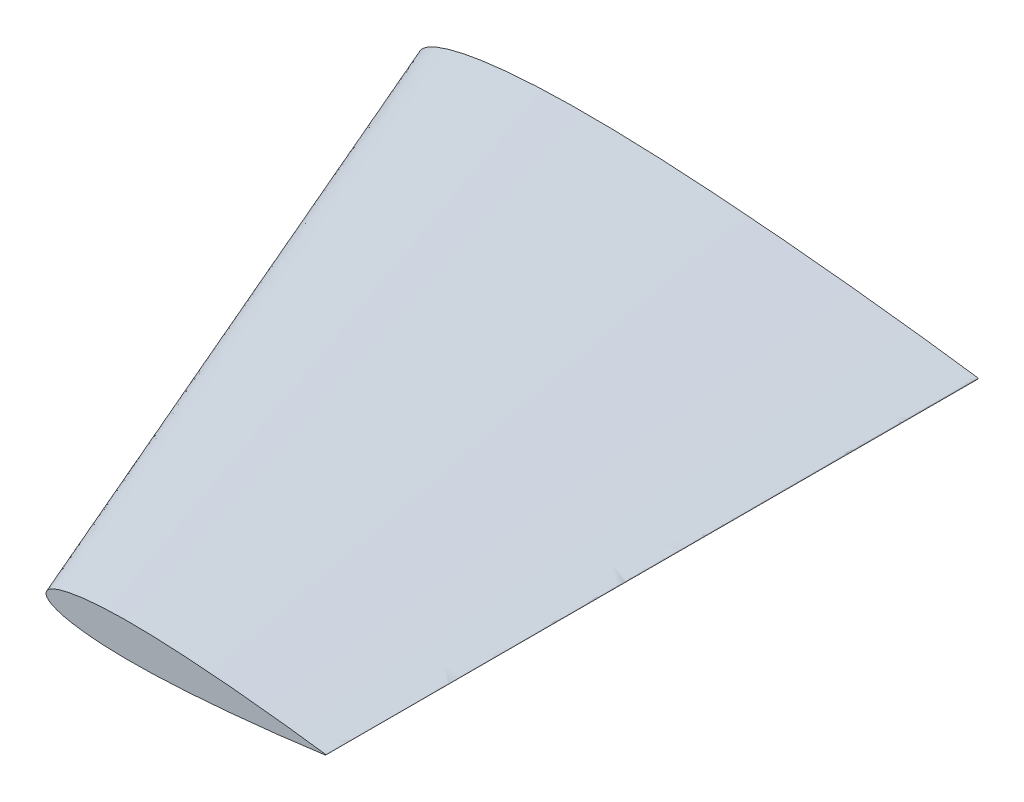
ISO-10303-21;
HEADER;
FILE_DESCRIPTION(('STEP AP214'),'2;1');
FILE_NAME('part.step','',(''),(''),'','','');
FILE_SCHEMA(('AUTOMOTIVE_DESIGN { 1 0 10303 214 1 1 1 1 }'));
ENDSEC;
DATA;
#1=APPLICATION_CONTEXT('core data for automotive mechanical design processes');
#2=APPLICATION_PROTOCOL_DEFINITION('international standard','automotive_design',2000,#1);
#3=PRODUCT_CONTEXT('',#1,'mechanical');
#4=PRODUCT('Part','Part','',(#3));
#5=PRODUCT_RELATED_PRODUCT_CATEGORY('part','',(#4));
#6=PRODUCT_DEFINITION_FORMATION('','',#4);
#7=PRODUCT_DEFINITION_CONTEXT('part definition',#1,'design');
#8=PRODUCT_DEFINITION('design','',#6,#7);
#9=PRODUCT_DEFINITION_SHAPE('','',#8);
#10=(LENGTH_UNIT() NAMED_UNIT(*) SI_UNIT(.MILLI.,.METRE.));
#11=(NAMED_UNIT(*) PLANE_ANGLE_UNIT() SI_UNIT($,.RADIAN.));
#12=(NAMED_UNIT(*) SI_UNIT($,.STERADIAN.) SOLID_ANGLE_UNIT());
#13=UNCERTAINTY_MEASURE_WITH_UNIT(LENGTH_MEASURE(1.E-05),#10,'distance_accuracy_value','');
#14=(GEOMETRIC_REPRESENTATION_CONTEXT(3) GLOBAL_UNCERTAINTY_ASSIGNED_CONTEXT((#13)) GLOBAL_UNIT_ASSIGNED_CONTEXT((#10,
#11,#12)) REPRESENTATION_CONTEXT('',''));
#15=CARTESIAN_POINT('',(0.,0.,0.));
#16=DIRECTION('',(0.,0.,1.));
#17=DIRECTION('',(1.,0.,0.));
#18=AXIS2_PLACEMENT_3D('',#15,#16,#17);
#19=CARTESIAN_POINT('',(59.9894386333707,-4.00551525600542E-05,140.));
#20=DIRECTION('',(0.,0.,-1.));
#21=DIRECTION('',(-1.,0.,0.));
#22=AXIS2_PLACEMENT_3D('',#19,#20,#21);
#23=PLANE('',#22);
#24=CARTESIAN_POINT('',(119.989438633371,0.0755599448474195,140.));
#25=CARTESIAN_POINT('',(119.977760672135,0.0771982213517054,140.));
#26=CARTESIAN_POINT('',(119.931077936651,0.0837472436647128,140.));
#27=CARTESIAN_POINT('',(119.826143972958,0.0984378266352626,140.));
#28=CARTESIAN_POINT('',(119.651527750558,0.122831359279345,140.));
#29=CARTESIAN_POINT('',(119.131424142651,0.19514668071627,140.));
#30=CARTESIAN_POINT('',(118.49813489711,0.281967600444363,140.));
#31=CARTESIAN_POINT('',(117.753099220509,0.38241410595405,140.));
#32=CARTESIAN_POINT('',(117.174553349319,0.459574184469222,140.));
#33=CARTESIAN_POINT('',(116.532515345587,0.544150806825612,140.));
#34=CARTESIAN_POINT('',(115.82848636801,0.635689658566935,140.));
#35=CARTESIAN_POINT('',(115.064106074129,0.733628285764136,140.));
#36=CARTESIAN_POINT('',(114.241163567525,0.837464462544656,140.));
#37=CARTESIAN_POINT('',(112.325731132425,1.07516105461548,140.));
#38=CARTESIAN_POINT('',(110.307188390592,1.31387642091954,140.));
#39=CARTESIAN_POINT('',(108.190297203449,1.55203568809978,140.));
#40=CARTESIAN_POINT('',(106.601951775327,1.72664019914746,140.));
#41=CARTESIAN_POINT('',(104.96225380303,1.90032948669299,140.));
#42=CARTESIAN_POINT('',(102.827693950811,2.11747163325587,140.));
#43=CARTESIAN_POINT('',(100.595297880558,2.33456982604891,140.));
#44=CARTESIAN_POINT('',(98.3209085445755,2.54104293056799,140.));
#45=CARTESIAN_POINT('',(95.9802563751749,2.74088639382706,140.));
#46=CARTESIAN_POINT('',(94.0775428220109,2.89228395484383,140.));
#47=CARTESIAN_POINT('',(92.1610314488525,3.03216992038016,140.));
#48=CARTESIAN_POINT('',(90.7140282293817,3.13093091055295,140.));
#49=CARTESIAN_POINT('',(89.2653299637386,3.22243112010886,140.));
#50=CARTESIAN_POINT('',(87.8183198930333,3.30589251250008,140.));
#51=CARTESIAN_POINT('',(86.3763769391599,3.38053971192769,140.));
#52=CARTESIAN_POINT('',(84.9428664541839,3.44562069699112,140.));
#53=CARTESIAN_POINT('',(83.5211351893416,3.50039678524716,140.));
#54=CARTESIAN_POINT('',(82.1145040220726,3.54416326114392,140.));
#55=CARTESIAN_POINT('',(80.726258367327,3.57628087904943,140.));
#56=CARTESIAN_POINT('',(79.3596368323917,3.59613911743068,140.));
#57=CARTESIAN_POINT('',(78.0178304349164,3.60319989774656,140.));
#58=CARTESIAN_POINT('',(76.7039721907908,3.59700148379893,140.));
#59=CARTESIAN_POINT('',(75.4211307435552,3.57717322654791,140.));
#60=CARTESIAN_POINT('',(74.1722990702693,3.54340817810898,140.));
#61=CARTESIAN_POINT('',(72.9603915852315,3.49552183270417,140.));
#62=CARTESIAN_POINT('',(71.7882377943993,3.43342467072735,140.));
#63=CARTESIAN_POINT('',(70.6585745254473,3.3571028179956,140.));
#64=CARTESIAN_POINT('',(69.5740334515321,3.26668441617754,140.));
#65=CARTESIAN_POINT('',(68.537141674869,3.16237861615865,140.));
#66=CARTESIAN_POINT('',(67.5503170155539,3.04447564778584,140.));
#67=CARTESIAN_POINT('',(66.6158528775061,2.91339666080123,140.));
#68=CARTESIAN_POINT('',(65.7359227695115,2.76958417080328,140.));
#69=CARTESIAN_POINT('',(64.9125575350325,2.61362838140723,140.));
#70=CARTESIAN_POINT('',(64.1476605624649,2.44609672129865,140.));
#71=CARTESIAN_POINT('',(63.4429724717206,2.26767741042281,140.));
#72=CARTESIAN_POINT('',(62.8000928636437,2.07901816116683,140.));
#73=CARTESIAN_POINT('',(62.2204366033757,1.88082974925656,140.));
#74=CARTESIAN_POINT('',(61.7052408907534,1.67377614680091,140.));
#75=CARTESIAN_POINT('',(61.2555278129767,1.458473652424,140.));
#76=CARTESIAN_POINT('',(60.8720947201196,1.23541031099098,140.));
#77=CARTESIAN_POINT('',(60.5555027705751,1.00483956445064,140.));
#78=CARTESIAN_POINT('',(60.306212938768,0.766541112241203,140.));
#79=CARTESIAN_POINT('',(60.1250318176147,0.519677952360911,140.));
#80=CARTESIAN_POINT('',(60.0141587950842,0.26317863603798,140.));
#81=CARTESIAN_POINT('',(59.9773882388846,-4.00551525705095E-05,140.));
#82=CARTESIAN_POINT('',(60.0141587950842,-0.263258746343157,140.));
#83=CARTESIAN_POINT('',(60.1250318176147,-0.519758062666065,140.));
#84=CARTESIAN_POINT('',(60.306212938768,-0.766621222546365,140.));
#85=CARTESIAN_POINT('',(60.5555027705751,-1.0049196747558,140.));
#86=CARTESIAN_POINT('',(60.8720947201196,-1.23549042129614,140.));
#87=CARTESIAN_POINT('',(61.2555278129767,-1.45855376272916,140.));
#88=CARTESIAN_POINT('',(61.7052408907534,-1.67385625710608,140.));
#89=CARTESIAN_POINT('',(62.2204366033757,-1.88090985956173,140.));
#90=CARTESIAN_POINT('',(62.8000928636437,-2.07909827147199,140.));
#91=CARTESIAN_POINT('',(63.4429724717206,-2.26775752072797,140.));
#92=CARTESIAN_POINT('',(64.1476605624649,-2.44617683160382,140.));
#93=CARTESIAN_POINT('',(64.9125575350325,-2.61370849171238,140.));
#94=CARTESIAN_POINT('',(65.7359227695115,-2.76966428110844,140.));
#95=CARTESIAN_POINT('',(66.6158528775061,-2.91347677110639,140.));
#96=CARTESIAN_POINT('',(67.5503170155539,-3.044555758091,140.));
#97=CARTESIAN_POINT('',(68.537141674869,-3.16245872646381,140.));
#98=CARTESIAN_POINT('',(69.5740334515321,-3.26676452648269,140.));
#99=CARTESIAN_POINT('',(70.6585745254473,-3.35718292830076,140.));
#100=CARTESIAN_POINT('',(71.7882377943993,-3.43350478103251,140.));
#101=CARTESIAN_POINT('',(72.9603915852315,-3.49560194300933,140.));
#102=CARTESIAN_POINT('',(74.1722990702693,-3.54348828841414,140.));
#103=CARTESIAN_POINT('',(75.4211307435552,-3.57725333685307,140.));
#104=CARTESIAN_POINT('',(76.7039721907908,-3.59708159410409,140.));
#105=CARTESIAN_POINT('',(78.0178304349164,-3.60328000805172,140.));
#106=CARTESIAN_POINT('',(79.3596368323917,-3.59621922773585,140.));
#107=CARTESIAN_POINT('',(80.726258367327,-3.57636098935459,140.));
#108=CARTESIAN_POINT('',(82.1145040220726,-3.54424337144909,140.));
#109=CARTESIAN_POINT('',(83.5211351893416,-3.50047689555232,140.));
#110=CARTESIAN_POINT('',(84.942866454184,-3.44570080729629,140.));
#111=CARTESIAN_POINT('',(86.3763769391599,-3.38061982223285,140.));
#112=CARTESIAN_POINT('',(87.8183198930333,-3.30597262280524,140.));
#113=CARTESIAN_POINT('',(89.2653299637386,-3.22251123041402,140.));
#114=CARTESIAN_POINT('',(90.7140282293817,-3.13101102085811,140.));
#115=CARTESIAN_POINT('',(92.1610314488525,-3.03225003068532,140.));
#116=CARTESIAN_POINT('',(94.0775428220109,-2.89236406514899,140.));
#117=CARTESIAN_POINT('',(95.9802563751749,-2.74096650413222,140.));
#118=CARTESIAN_POINT('',(98.3209085445755,-2.54112304087315,140.));
#119=CARTESIAN_POINT('',(100.595297761509,-2.33464772105769,140.));
#120=CARTESIAN_POINT('',(103.244570565363,-2.07701134281794,140.));
#121=CARTESIAN_POINT('',(105.378829108634,-1.85686662952319,140.));
#122=CARTESIAN_POINT('',(107.018285342146,-1.68095336381209,140.));
#123=CARTESIAN_POINT('',(108.190297203449,-1.55211579840494,140.));
#124=CARTESIAN_POINT('',(110.307188390592,-1.3139565312247,140.));
#125=CARTESIAN_POINT('',(112.325731132425,-1.07524116492064,140.));
#126=CARTESIAN_POINT('',(114.241163567525,-0.837544572849816,140.));
#127=CARTESIAN_POINT('',(115.064106074129,-0.733708396069295,140.));
#128=CARTESIAN_POINT('',(115.82848636801,-0.635769768872097,140.));
#129=CARTESIAN_POINT('',(116.532515345587,-0.544230917130772,140.));
#130=CARTESIAN_POINT('',(117.174553349319,-0.459654294774382,140.));
#131=CARTESIAN_POINT('',(118.029520349942,-0.345628209409237,140.));
#132=CARTESIAN_POINT('',(118.774446860712,-0.244367616838821,140.));
#133=CARTESIAN_POINT('',(119.407635638707,-0.156822283115304,140.));
#134=CARTESIAN_POINT('',(119.651527750558,-0.122911469584506,140.));
#135=CARTESIAN_POINT('',(119.826143972958,-0.0985179369404232,140.));
#136=CARTESIAN_POINT('',(119.931077936651,-0.0838273539698737,140.));
#137=CARTESIAN_POINT('',(119.977760672135,-0.0772783316568664,140.));
#138=CARTESIAN_POINT('',(119.989438633371,-0.0756400551525805,140.));
#139=B_SPLINE_CURVE_WITH_KNOTS('',3,(#24,#25,#26,#27,#28,#29,#30,#31,#32,#33,#34,#35,#36,#37,
#38,#39,#40,#41,#42,#43,#44,#45,#46,#47,#48,#49,#50,#51,#52,#53,#54,#55,#56,#57,#58,#59,#60,#61,
#62,#63,#64,#65,#66,#67,#68,#69,#70,#71,#72,#73,#74,#75,#76,#77,#78,#79,#80,#81,#82,#83,#84,#85,
#86,#87,#88,#89,#90,#91,#92,#93,#94,#95,#96,#97,#98,#99,#100,#101,#102,#103,#104,#105,#106,#107,
#108,#109,#110,#111,#112,#113,#114,#115,#116,#117,#118,#119,#120,#121,#122,#123,#124,#125,#126,
#127,#128,#129,#130,#131,#132,#133,#134,#135,#136,#137,#138),.UNSPECIFIED.,.F.,.F.,(4,1,1,1,1,1,
1,1,1,1,1,1,1,1,1,1,1,1,1,1,1,1,1,1,1,1,1,1,1,1,1,1,1,1,1,1,1,1,1,1,1,1,1,1,1,1,1,1,1,1,1,1,1,1,
1,1,1,1,1,1,1,1,1,1,1,1,1,1,1,1,1,1,1,1,1,1,1,1,1,1,1,1,1,1,1,1,1,1,1,1,1,1,1,1,1,1,1,1,1,1,1,1,
1,1,1,1,1,1,1,1,1,1,4),(0.,0.000289146012208075,0.00115586329945758,0.00259805874790931,
0.00461228876571106,0.0140314129150333,0.018271453485421,0.0230457375913407,0.0283428821695204,
0.0341501370920947,0.0404537305224403,0.0472385925337366,0.0544885550062153,0.0877800920894453,
0.0970773621435759,0.106721846803723,0.126960675542605,0.137507310724012,0.159331010090231,
0.181956676151837,0.193504010213206,0.216932159347369,0.22875798652107,0.240621460081089,
0.252494885661238,0.26435049076449,0.276160731135953,0.287898257272151,0.299535924833915,
0.311046958730048,0.322405016007326,0.33358424112908,0.34455942720365,0.355305876694046,
0.365799652157998,0.376017632735469,0.385937515259466,0.395537820767709,0.404798053904225,
0.413698796542159,0.422221689314506,0.430349461124564,0.4380661515799,0.445357166330782,
0.452209423283855,0.458611485415413,0.464554009305642,0.47002993753563,0.475035084210348,
0.479569178588025,0.483636915774579,0.487250221980046,0.490431492848229,0.493218846943702,
0.495674070493982,0.497891229124202,0.5,0.502108770875798,0.504325929506018,0.506781153056299,
0.509568507151771,0.512749778019954,0.516363084225421,0.520430821411975,0.524964915789652,
0.529970062464371,0.535445990694358,0.541388514584587,0.547790576716145,0.554642833669218,
0.5619338484201,0.569650538875436,0.577778310685494,0.586301203457841,0.595201946095775,
0.604462179232291,0.614062484740534,0.623982367264531,0.634200347842002,0.644694123305954,
0.65544057279635,0.66641575887092,0.677594983992674,0.688953041269952,0.700464075166085,
0.712101742727849,0.723839268864047,0.73564950923551,0.747505114338762,0.759378539918911,
0.77124201347893,0.783067840652631,0.806495989786793,0.818043323848163,0.840668989909769,
0.862492689275988,0.883309251747965,0.893278153196277,0.902922637856424,0.912219907910555,
0.945511444993785,0.952761407466263,0.95954626947756,0.965849862907905,0.97165711783048,
0.976954262408659,0.981728546514579,0.992806407026601,0.995387711234289,0.997401941252091,
0.998844136700542,0.999710853987792,1.),.UNSPECIFIED.);
#140=CARTESIAN_POINT('',(119.989395735374,0.0755659629140516,140.));
#141=VERTEX_POINT('',#140);
#142=CARTESIAN_POINT('',(119.989438633371,-0.0756400551525805,140.));
#143=VERTEX_POINT('',#142);
#144=EDGE_CURVE('E100',#141,#143,#139,.T.);
#145=ORIENTED_EDGE('',*,*,#144,.T.);
#146=CARTESIAN_POINT('',(119.978832869126,-4.00551525804892E-05,140.));
#147=DIRECTION('',(0.,0.,1.));
#148=DIRECTION('',(1.,0.,0.));
#149=AXIS2_PLACEMENT_3D('',#146,#147,#148);
#150=CIRCLE('',#149,0.076340305443589);
#151=EDGE_CURVE('E12',#143,#141,#150,.T.);
#152=ORIENTED_EDGE('',*,*,#151,.T.);
#153=EDGE_LOOP('',(#145,#152));
#154=FACE_BOUND('',#153,.T.);
#155=ADVANCED_FACE('F89',(#154),#23,.F.);
#156=CARTESIAN_POINT('',(0.,0.,0.));
#157=DIRECTION('',(0.,0.,-1.));
#158=DIRECTION('',(-1.,0.,0.));
#159=AXIS2_PLACEMENT_3D('',#156,#157,#158);
#160=PLANE('',#159);
#161=CARTESIAN_POINT('',(59.9787961414409,0.,0.));
#162=DIRECTION('',(0.,0.,-1.));
#163=DIRECTION('',(-1.,0.,0.));
#164=AXIS2_PLACEMENT_3D('',#161,#162,#163);
#165=CIRCLE('',#164,3.175);
#166=CARTESIAN_POINT('',(56.8037961414409,0.,0.));
#167=VERTEX_POINT('',#166);
#168=EDGE_CURVE('E232',#167,#167,#165,.T.);
#169=ORIENTED_EDGE('',*,*,#168,.F.);
#170=EDGE_LOOP('',(#169));
#171=FACE_BOUND('',#170,.T.);
#172=CARTESIAN_POINT('',(120.,0.1512,0.));
#173=CARTESIAN_POINT('',(119.938360578888,0.159844137347324,0.));
#174=CARTESIAN_POINT('',(119.692138685619,0.19437359633567,0.));
#175=CARTESIAN_POINT('',(119.139560673311,0.271412422978929,0.));
#176=CARTESIAN_POINT('',(118.222411648982,0.398714999696628,0.));
#177=CARTESIAN_POINT('',(116.946295832479,0.573372813181282,0.));
#178=CARTESIAN_POINT('',(115.31914257336,0.793379556505386,0.));
#179=CARTESIAN_POINT('',(113.350899215231,1.05429059343617,0.));
#180=CARTESIAN_POINT('',(111.053721993888,1.35259671544932,0.));
#181=CARTESIAN_POINT('',(108.441806165386,1.68360641638297,0.));
#182=CARTESIAN_POINT('',(105.531225850739,2.04287549149059,0.));
#183=CARTESIAN_POINT('',(102.339929512727,2.42510757284941,0.));
#184=CARTESIAN_POINT('',(98.8876137375159,2.82569722878243,0.));
#185=CARTESIAN_POINT('',(95.1955133959612,3.23914927522709,0.));
#186=CARTESIAN_POINT('',(91.2864118046433,3.66042814404131,0.));
#187=CARTESIAN_POINT('',(87.1844353516124,4.08429786298671,0.));
#188=CARTESIAN_POINT('',(82.9148647358288,4.50528837060748,0.));
#189=CARTESIAN_POINT('',(78.5040347401696,4.91748992259431,0.));
#190=CARTESIAN_POINT('',(73.9791092178014,5.31549124878388,0.));
#191=CARTESIAN_POINT('',(69.3680352916593,5.69263845539148,0.));
#192=CARTESIAN_POINT('',(64.6991459982131,6.04278214880497,0.));
#193=CARTESIAN_POINT('',(60.0012690085399,6.35942163015905,0.));
#194=CARTESIAN_POINT('',(55.3033498169987,6.63593624158965,0.));
#195=CARTESIAN_POINT('',(50.6343098823181,6.86534018989618,0.));
#196=CARTESIAN_POINT('',(46.0229850460557,7.04151620542667,0.));
#197=CARTESIAN_POINT('',(41.4976726291457,7.15871676514485,0.));
#198=CARTESIAN_POINT('',(37.0863381388909,7.21121734985656,0.));
#199=CARTESIAN_POINT('',(32.8160874005536,7.19485149095633,0.));
#200=CARTESIAN_POINT('',(28.7132476233335,7.10645799048529,0.));
#201=CARTESIAN_POINT('',(24.8030736589301,6.94379616983885,0.));
#202=CARTESIAN_POINT('',(21.1096333775127,6.70644053105106,0.));
#203=CARTESIAN_POINT('',(17.6556267975428,6.39510526155758,0.));
#204=CARTESIAN_POINT('',(14.4621899805176,6.01222190315094,0.));
#205=CARTESIAN_POINT('',(11.5487879471843,5.56104822654729,0.));
#206=CARTESIAN_POINT('',(8.9330752091326,5.04629635518779,0.));
#207=CARTESIAN_POINT('',(6.63038281864793,4.47378672590563,0.));
#208=CARTESIAN_POINT('',(4.65379567288449,3.84910202152081,0.));
#209=CARTESIAN_POINT('',(3.0133561313821,3.17806031246354,0.));
#210=CARTESIAN_POINT('',(1.71429560147794,2.4652015113598,0.));
#211=CARTESIAN_POINT('',(0.758613027695714,1.70911865479834,0.));
#212=CARTESIAN_POINT('',(0.146506114579862,0.891520380412207,0.));
#213=CARTESIAN_POINT('',(-0.068277058318918,0.,0.));
#214=CARTESIAN_POINT('',(0.146506114579865,-0.891520380412218,0.));
#215=CARTESIAN_POINT('',(0.758613027695713,-1.70911865479834,0.));
#216=CARTESIAN_POINT('',(1.71429560147796,-2.46520151135981,0.));
#217=CARTESIAN_POINT('',(3.01335613138207,-3.17806031246353,0.));
#218=CARTESIAN_POINT('',(4.65379567288451,-3.84910202152082,0.));
#219=CARTESIAN_POINT('',(6.63038281864793,-4.47378672590563,0.));
#220=CARTESIAN_POINT('',(8.93307520913258,-5.04629635518778,0.));
#221=CARTESIAN_POINT('',(11.5487879471843,-5.56104822654729,0.));
#222=CARTESIAN_POINT('',(14.4621899805177,-6.01222190315095,0.));
#223=CARTESIAN_POINT('',(17.6556267975428,-6.39510526155758,0.));
#224=CARTESIAN_POINT('',(21.1096333775127,-6.70644053105106,0.));
#225=CARTESIAN_POINT('',(24.8030736589301,-6.94379616983885,0.));
#226=CARTESIAN_POINT('',(28.7132476233335,-7.10645799048529,0.));
#227=CARTESIAN_POINT('',(32.8160874005535,-7.19485149095632,0.));
#228=CARTESIAN_POINT('',(37.0863381388909,-7.21121734985656,0.));
#229=CARTESIAN_POINT('',(41.4976726291457,-7.15871676514485,0.));
#230=CARTESIAN_POINT('',(46.0229850460557,-7.04151620542667,0.));
#231=CARTESIAN_POINT('',(50.6343098823181,-6.86534018989618,0.));
#232=CARTESIAN_POINT('',(55.3033498169987,-6.63593624158965,0.));
#233=CARTESIAN_POINT('',(60.0012690085398,-6.35942163015905,0.));
#234=CARTESIAN_POINT('',(64.6991459982131,-6.04278214880497,0.));
#235=CARTESIAN_POINT('',(69.3680352916593,-5.69263845539148,0.));
#236=CARTESIAN_POINT('',(73.9791092178014,-5.31549124878388,0.));
#237=CARTESIAN_POINT('',(78.5040347401696,-4.91748992259432,0.));
#238=CARTESIAN_POINT('',(82.9148647358288,-4.50528837060748,0.));
#239=CARTESIAN_POINT('',(87.1844353516124,-4.08429786298671,0.));
#240=CARTESIAN_POINT('',(91.2864118046433,-3.66042814404131,0.));
#241=CARTESIAN_POINT('',(95.1955133959612,-3.2391492752271,0.));
#242=CARTESIAN_POINT('',(98.8876137375159,-2.82569722878243,0.));
#243=CARTESIAN_POINT('',(102.339929512727,-2.42510757284941,0.));
#244=CARTESIAN_POINT('',(105.531225850739,-2.04287549149059,0.));
#245=CARTESIAN_POINT('',(108.441806165386,-1.68360641638297,0.));
#246=CARTESIAN_POINT('',(111.053721993888,-1.35259671544931,0.));
#247=CARTESIAN_POINT('',(113.350899215231,-1.05429059343617,0.));
#248=CARTESIAN_POINT('',(115.31914257336,-0.793379556505386,0.));
#249=CARTESIAN_POINT('',(116.946295832479,-0.573372813181286,0.));
#250=CARTESIAN_POINT('',(118.222411648982,-0.398714999696624,0.));
#251=CARTESIAN_POINT('',(119.13956067331,-0.271412422978929,0.));
#252=CARTESIAN_POINT('',(119.692138685619,-0.194373596335671,0.));
#253=CARTESIAN_POINT('',(119.938360578888,-0.159844137347324,0.));
#254=CARTESIAN_POINT('',(120.,-0.1512,0.));
#255=B_SPLINE_CURVE_WITH_KNOTS('',3,(#172,#173,#174,#175,#176,#177,#178,#179,#180,#181,#182,
#183,#184,#185,#186,#187,#188,#189,#190,#191,#192,#193,#194,#195,#196,#197,#198,#199,#200,#201,
#202,#203,#204,#205,#206,#207,#208,#209,#210,#211,#212,#213,#214,#215,#216,#217,#218,#219,#220,
#221,#222,#223,#224,#225,#226,#227,#228,#229,#230,#231,#232,#233,#234,#235,#236,#237,#238,#239,
#240,#241,#242,#243,#244,#245,#246,#247,#248,#249,#250,#251,#252,#253,#254),.UNSPECIFIED.,.F.,
.F.,(4,1,1,1,1,1,1,1,1,1,1,1,1,1,1,1,1,1,1,1,1,1,1,1,1,1,1,1,1,1,1,1,1,1,1,1,1,1,1,1,1,1,1,1,1,
1,1,1,1,1,1,1,1,1,1,1,1,1,1,1,1,1,1,1,1,1,1,1,1,1,1,1,1,1,1,1,1,1,1,1,4),(0.,
0.000763156679271425,0.00304846929193479,0.00684068957953664,0.0121161317605396,
0.0188407924276644,0.0269727495182071,0.0364598537113803,0.0472429445210447,0.0592535547279477,
0.0724172643119224,0.0866510217067198,0.101866322474926,0.117968955401192,0.134857918638583,
0.152428309483259,0.170571841082248,0.189174521814912,0.208122338288737,0.227296649324545,
0.246580070424687,0.265853108019993,0.284996761496293,0.303895241632262,0.322432580929281,
0.340498658943124,0.357984483489282,0.37478811429809,0.390812303248415,0.405965006366899,
0.420162443159487,0.433328264782086,0.445393603392471,0.456301171479378,0.466003880875037,
0.474472000637231,0.481696232103684,0.487703697963338,0.492583405321471,0.496543603187854,0.5,
0.503456396812145,0.507416594678528,0.512296302036662,0.518303767896316,0.525527999362769,
0.533996119124963,0.543698828520622,0.554606396607529,0.566671735217914,0.579837556840513,
0.594034993633101,0.609187696751585,0.62521188570191,0.642015516510718,0.659501341056876,
0.677567419070719,0.696104758367738,0.715003238503707,0.734146891980006,0.753419929575313,
0.772703350675455,0.791877661711263,0.810825478185088,0.829428158917752,0.847571690516741,
0.865142081361417,0.882031044598808,0.898133677525074,0.91334897829328,0.927582735688077,
0.940746445272052,0.952757055478955,0.96354014628862,0.973027250481793,0.981159207572336,
0.98788386823946,0.993159310420463,0.996951530708065,0.999236843320729,1.),.UNSPECIFIED.);
#256=CARTESIAN_POINT('',(120.,0.1512,0.));
#257=VERTEX_POINT('',#256);
#258=CARTESIAN_POINT('',(-0.000153937934913733,0.,0.));
#259=VERTEX_POINT('',#258);
#260=EDGE_CURVE('E127',#257,#259,#255,.T.);
#261=ORIENTED_EDGE('',*,*,#260,.F.);
#262=CARTESIAN_POINT('',(119.978796141441,0.,0.));
#263=DIRECTION('',(0.,0.,1.));
#264=DIRECTION('',(1.,0.,0.));
#265=AXIS2_PLACEMENT_3D('',#262,#263,#264);
#266=CIRCLE('',#265,0.152679545512138);
#267=CARTESIAN_POINT('',(120.,-0.1512,0.));
#268=VERTEX_POINT('',#267);
#269=EDGE_CURVE('E122',#268,#257,#266,.T.);
#270=ORIENTED_EDGE('',*,*,#269,.F.);
#271=CARTESIAN_POINT('',(120.000000765176,-0.151199892693838,0.));
#272=CARTESIAN_POINT('',(120.03607256773,-0.146141285555425,0.));
#273=CARTESIAN_POINT('',(120.104344916749,-0.109152762576308,0.));
#274=CARTESIAN_POINT('',(120.145140810772,0.,0.));
#275=CARTESIAN_POINT('',(120.104344916749,0.109152762576307,0.));
#276=CARTESIAN_POINT('',(120.03607256773,0.146141285555425,0.));
#277=CARTESIAN_POINT('',(117.475613580538,0.505212781658082,0.));
#278=CARTESIAN_POINT('',(112.423158190474,1.18682888803539,0.));
#279=CARTESIAN_POINT('',(104.835008242649,2.13642195370506,0.));
#280=CARTESIAN_POINT('',(97.2389545502086,3.02039736206679,0.));
#281=CARTESIAN_POINT('',(90.9029625771843,3.70405722846481,0.));
#282=CARTESIAN_POINT('',(85.830895309285,4.21937133138275,0.));
#283=CARTESIAN_POINT('',(82.025204186488,4.58938117662125,0.));
#284=CARTESIAN_POINT('',(78.2178882066806,4.9422720729514,0.));
#285=CARTESIAN_POINT('',(74.4089675750848,5.27742082995157,0.));
#286=CARTESIAN_POINT('',(70.5983977935165,5.59328870705533,0.));
#287=CARTESIAN_POINT('',(66.7861721316473,5.88852717504824,0.));
#288=CARTESIAN_POINT('',(62.9722792482619,6.16142337408509,0.));
#289=CARTESIAN_POINT('',(59.1567134253141,6.40989336188028,0.));
#290=CARTESIAN_POINT('',(55.3394831019751,6.63140869072649,0.));
#291=CARTESIAN_POINT('',(51.5206177186251,6.82282220000056,0.));
#292=CARTESIAN_POINT('',(47.7002172255508,6.98082741605172,0.));
#293=CARTESIAN_POINT('',(43.8784481019074,7.1015879308216,0.));
#294=CARTESIAN_POINT('',(40.0555633037056,7.18024949401692,0.));
#295=CARTESIAN_POINT('',(36.2319774531991,7.21102452750492,0.));
#296=CARTESIAN_POINT('',(33.045587501169,7.1913391603455,0.));
#297=CARTESIAN_POINT('',(30.4969124156708,7.14428850605238,0.));
#298=CARTESIAN_POINT('',(28.5857942726051,7.09203343211921,0.));
#299=CARTESIAN_POINT('',(26.6752587745434,7.02150034713793,0.));
#300=CARTESIAN_POINT('',(24.7655592343241,6.93103201421412,0.));
#301=CARTESIAN_POINT('',(22.8570008381416,6.8189518637653,0.));
#302=CARTESIAN_POINT('',(20.9499848953426,6.68301376119736,0.));
#303=CARTESIAN_POINT('',(19.0450168184748,6.52079283619768,0.));
#304=CARTESIAN_POINT('',(17.1427618263081,6.32921098115144,0.));
#305=CARTESIAN_POINT('',(15.2441068738919,6.10460458662309,0.));
#306=CARTESIAN_POINT('',(13.3502816531551,5.84214704220121,0.));
#307=CARTESIAN_POINT('',(11.7775866935181,5.58667435628076,0.));
#308=CARTESIAN_POINT('',(10.5240237832819,5.35615750238631,0.));
#309=CARTESIAN_POINT('',(9.58664970874971,5.16869018921688,0.));
#310=CARTESIAN_POINT('',(8.65265293002554,4.96500834487877,0.));
#311=CARTESIAN_POINT('',(7.72272822111203,4.74344467921921,0.));
#312=CARTESIAN_POINT('',(6.79807850643509,4.50069204929509,0.));
#313=CARTESIAN_POINT('',(5.87992952485039,4.23441263416601,0.));
#314=CARTESIAN_POINT('',(4.97052777439172,3.93930252490355,0.));
#315=CARTESIAN_POINT('',(4.07290713991055,3.61026372575085,0.));
#316=CARTESIAN_POINT('',(3.19163631303956,3.23858276691492,0.));
#317=CARTESIAN_POINT('',(2.33577845439907,2.81211709799558,0.));
#318=CARTESIAN_POINT('',(1.51854455403164,2.31283576457246,0.));
#319=CARTESIAN_POINT('',(0.775532009714185,1.70735132319795,0.));
#320=CARTESIAN_POINT('',(0.173067454678413,0.952420314479724,0.));
#321=CARTESIAN_POINT('',(-0.0867646342415888,0.,0.));
#322=CARTESIAN_POINT('',(0.17306745467846,-0.952420314479802,0.));
#323=CARTESIAN_POINT('',(0.775532009714271,-1.70735132319804,0.));
#324=CARTESIAN_POINT('',(1.5185445540317,-2.31283576457249,0.));
#325=CARTESIAN_POINT('',(2.33577845439914,-2.81211709799562,0.));
#326=CARTESIAN_POINT('',(3.19163631303961,-3.23858276691494,0.));
#327=CARTESIAN_POINT('',(4.07290713991058,-3.61026372575087,0.));
#328=CARTESIAN_POINT('',(4.97052777439181,-3.93930252490358,0.));
#329=CARTESIAN_POINT('',(5.87992952485046,-4.23441263416604,0.));
#330=CARTESIAN_POINT('',(6.79807850643517,-4.50069204929512,0.));
#331=CARTESIAN_POINT('',(7.72272822111219,-4.74344467921923,0.));
#332=CARTESIAN_POINT('',(8.65265293002557,-4.96500834487879,0.));
#333=CARTESIAN_POINT('',(9.58664970874982,-5.16869018921689,0.));
#334=CARTESIAN_POINT('',(10.5240237832819,-5.35615750238631,0.));
#335=CARTESIAN_POINT('',(11.7775866935182,-5.58667435628077,0.));
#336=CARTESIAN_POINT('',(13.3502816531551,-5.8421470422012,0.));
#337=CARTESIAN_POINT('',(15.244106873892,-6.1046045866231,0.));
#338=CARTESIAN_POINT('',(17.1427618263081,-6.32921098115143,0.));
#339=CARTESIAN_POINT('',(19.0450168184748,-6.52079283619769,0.));
#340=CARTESIAN_POINT('',(20.9499848953427,-6.68301376119736,0.));
#341=CARTESIAN_POINT('',(22.8570008381415,-6.8189518637653,0.));
#342=CARTESIAN_POINT('',(24.7655592343242,-6.93103201421413,0.));
#343=CARTESIAN_POINT('',(26.6752587745434,-7.02150034713794,0.));
#344=CARTESIAN_POINT('',(28.5857942726051,-7.09203343211921,0.));
#345=CARTESIAN_POINT('',(30.4969124156708,-7.14428850605238,0.));
#346=CARTESIAN_POINT('',(33.0455875011688,-7.19133916034551,0.));
#347=CARTESIAN_POINT('',(36.2319774531992,-7.21102452750491,0.));
#348=CARTESIAN_POINT('',(40.0555633037054,-7.18024949401693,0.));
#349=CARTESIAN_POINT('',(43.8784481019074,-7.10158793082161,0.));
#350=CARTESIAN_POINT('',(47.7002172255506,-6.98082741605173,0.));
#351=CARTESIAN_POINT('',(51.5206177186252,-6.82282220000056,0.));
#352=CARTESIAN_POINT('',(55.339483101975,-6.6314086907265,0.));
#353=CARTESIAN_POINT('',(59.1567134253141,-6.40989336188026,0.));
#354=CARTESIAN_POINT('',(62.9722792482619,-6.16142337408511,0.));
#355=CARTESIAN_POINT('',(66.7861721316472,-5.88852717504823,0.));
#356=CARTESIAN_POINT('',(70.5983977935167,-5.59328870705533,0.));
#357=CARTESIAN_POINT('',(74.4089675750846,-5.27742082995158,0.));
#358=CARTESIAN_POINT('',(78.2178882066809,-4.9422720729514,0.));
#359=CARTESIAN_POINT('',(82.0252041864877,-4.58938117662124,0.));
#360=CARTESIAN_POINT('',(85.8308953092853,-4.21937133138275,0.));
#361=CARTESIAN_POINT('',(90.902962577184,-3.70405722846482,0.));
#362=CARTESIAN_POINT('',(97.2389545502088,-3.02039736206677,0.));
#363=CARTESIAN_POINT('',(104.835008242649,-2.13642195370508,0.));
#364=CARTESIAN_POINT('',(112.423158190474,-1.18682888803538,0.));
#365=CARTESIAN_POINT('',(117.475613580538,-0.505212781658084,0.));
#366=CARTESIAN_POINT('',(120.000000765176,-0.151199892693838,0.));
#367=B_SPLINE_CURVE_WITH_KNOTS('',3,(#271,#272,#273,#274,#275,#276,#277,#278,#279,#280,#281,
#282,#283,#284,#285,#286,#287,#288,#289,#290,#291,#292,#293,#294,#295,#296,#297,#298,#299,#300,
#301,#302,#303,#304,#305,#306,#307,#308,#309,#310,#311,#312,#313,#314,#315,#316,#317,#318,#319,
#320,#321,#322,#323,#324,#325,#326,#327,#328,#329,#330,#331,#332,#333,#334,#335,#336,#337,#338,
#339,#340,#341,#342,#343,#344,#345,#346,#347,#348,#349,#350,#351,#352,#353,#354,#355,#356,#357,
#358,#359,#360,#361,#362,#363,#364,#365,#366),.UNSPECIFIED.,.T.,.F.,(4,1,1,1,2,1,1,1,1,1,1,1,1,
1,1,1,1,1,1,1,1,1,1,1,1,1,1,1,1,1,1,1,1,1,1,1,1,1,1,1,1,1,1,1,1,1,1,1,1,1,1,1,1,1,1,1,1,1,1,1,1,
1,1,1,1,1,1,1,1,1,1,1,1,1,1,1,1,1,1,1,1,1,1,1,1,1,1,1,1,1,1,1,4),(0.,0.000445745399777454,
0.000891490799554908,0.00133723619933236,0.00178298159910982,0.0329772634241376,
0.0641715452491654,0.0953658270741933,0.126560108899221,0.142157249811735,0.157754390724249,
0.173351531636763,0.188948672549277,0.204545813461791,0.220142954374305,0.235740095286818,
0.251337236199332,0.266934377111846,0.28253151802436,0.298128658936874,0.313725799849388,
0.329322940761902,0.344920081674416,0.36051722258693,0.368315793043187,0.376114363499444,
0.383912933955701,0.391711504411958,0.399510074868214,0.407308645324471,0.415107215780728,
0.422905786236985,0.430704356693242,0.438502927149499,0.446301497605756,0.450200782833885,
0.454100068062013,0.457999353290142,0.46189863851827,0.465797923746399,0.469697208974527,
0.473596494202656,0.477495779430784,0.481395064658913,0.485294349887041,0.48919363511517,
0.493092920343298,0.496992205571426,0.500891490799555,0.504790776027684,0.508690061255812,
0.51258934648394,0.516488631712069,0.520387916940197,0.524287202168326,0.528186487396454,
0.532085772624583,0.535985057852711,0.53988434308084,0.543783628308968,0.547682913537097,
0.551582198765225,0.555481483993354,0.563280054449611,0.571078624905868,0.578877195362125,
0.586675765818382,0.594474336274639,0.602272906730895,0.610071477187152,0.617870047643409,
0.625668618099666,0.633467188555923,0.64126575901218,0.656862899924694,0.672460040837208,
0.688057181749722,0.703654322662236,0.71925146357475,0.734848604487264,0.750445745399777,
0.766042886312291,0.781640027224805,0.797237168137319,0.812834309049833,0.828431449962347,
0.844028590874861,0.859625731787375,0.875222872699889,0.906417154524917,0.937611436349944,
0.968805718174972,1.),.UNSPECIFIED.);
#368=EDGE_CURVE('E93',#259,#268,#367,.T.);
#369=ORIENTED_EDGE('',*,*,#368,.F.);
#370=EDGE_LOOP('',(#261,#270,#369));
#371=FACE_BOUND('',#370,.T.);
#372=ADVANCED_FACE('F125',(#171,#371),#160,.T.);
#373=CARTESIAN_POINT('',(120.000000765176,-0.151199892693838,0.));
#374=CARTESIAN_POINT('',(119.989438930474,-0.0756400134726519,140.));
#375=CARTESIAN_POINT('',(120.03607256773,-0.146141285555425,0.));
#376=CARTESIAN_POINT('',(120.007474710721,-0.0731098119742105,140.));
#377=CARTESIAN_POINT('',(120.104344916749,-0.109152762576308,0.));
#378=CARTESIAN_POINT('',(120.041581758285,-0.0546607690781377,140.));
#379=CARTESIAN_POINT('',(120.145140810772,0.,0.));
#380=CARTESIAN_POINT('',(120.062023391678,2.95855469698955E-05,140.));
#381=CARTESIAN_POINT('',(120.104344916749,0.109152762576307,0.));
#382=CARTESIAN_POINT('',(120.041567914779,0.0545346839460324,140.));
#383=CARTESIAN_POINT('',(120.03607256773,0.146141285555425,0.));
#384=CARTESIAN_POINT('',(120.007474710721,0.0730297016690495,140.));
#385=CARTESIAN_POINT('',(117.475613580538,0.505212781658082,0.));
#386=CARTESIAN_POINT('',(118.727253808063,0.252629186789705,140.));
#387=CARTESIAN_POINT('',(112.423158190474,1.18682888803539,0.));
#388=CARTESIAN_POINT('',(116.201014936704,0.59332891609683,140.));
#389=CARTESIAN_POINT('',(104.835008242649,2.13642195370506,0.));
#390=CARTESIAN_POINT('',(112.406953320954,1.06821766851752,140.));
#391=CARTESIAN_POINT('',(97.2389545502086,3.02039736206679,0.));
#392=CARTESIAN_POINT('',(108.608918729693,1.51011971151652,140.));
#393=CARTESIAN_POINT('',(90.9029625771843,3.70405722846481,0.));
#394=CARTESIAN_POINT('',(105.440936417823,1.85204213818119,140.));
#395=CARTESIAN_POINT('',(85.830895309285,4.21937133138275,0.));
#396=CARTESIAN_POINT('',(102.904898898951,2.10965868187219,140.));
#397=CARTESIAN_POINT('',(82.025204186488,4.58938117662125,0.));
#398=CARTESIAN_POINT('',(101.002053584832,2.29464740197461,140.));
#399=CARTESIAN_POINT('',(78.2178882066806,4.9422720729514,0.));
#400=CARTESIAN_POINT('',(99.0983997554743,2.47114944556578,140.));
#401=CARTESIAN_POINT('',(74.4089675750848,5.27742082995157,0.));
#402=CARTESIAN_POINT('',(97.1939337971032,2.63864216310446,140.));
#403=CARTESIAN_POINT('',(70.5983977935165,5.59328870705533,0.));
#404=CARTESIAN_POINT('',(95.2886520959456,2.79660290504943,140.));
#405=CARTESIAN_POINT('',(66.7861721316473,5.88852717504824,0.));
#406=CARTESIAN_POINT('',(93.3825418326018,2.94423751345723,140.));
#407=CARTESIAN_POINT('',(62.9722792482619,6.16142337408509,0.));
#408=CARTESIAN_POINT('',(91.4755981164305,3.08070792261073,140.));
#409=CARTESIAN_POINT('',(59.1567134253141,6.40989336188028,0.));
#410=CARTESIAN_POINT('',(89.5678147706214,3.20491663392606,140.));
#411=CARTESIAN_POINT('',(55.3394831019751,6.63140869072649,0.));
#412=CARTESIAN_POINT('',(87.6591974455352,3.31562767717859,140.));
#413=CARTESIAN_POINT('',(51.5206177186251,6.82282220000056,0.));
#414=CARTESIAN_POINT('',(85.7497679775523,3.4113635469262,140.));
#415=CARTESIAN_POINT('',(47.7002172255508,6.98082741605172,0.));
#416=CARTESIAN_POINT('',(83.8395708392975,3.49041651224899,140.));
#417=CARTESIAN_POINT('',(43.8784481019074,7.1015879308216,0.));
#418=CARTESIAN_POINT('',(81.9286857667321,3.55075626672003,140.));
#419=CARTESIAN_POINT('',(40.0555633037056,7.18024949401692,0.));
#420=CARTESIAN_POINT('',(80.0172451905293,3.59004911353161,140.));
#421=CARTESIAN_POINT('',(36.2319774531991,7.21102452750492,0.));
#422=CARTESIAN_POINT('',(78.1054526419963,3.60547255642847,140.));
#423=CARTESIAN_POINT('',(33.045587501169,7.1913391603455,0.));
#424=CARTESIAN_POINT('',(76.5122610705266,3.595635614544,140.));
#425=CARTESIAN_POINT('',(30.4969124156708,7.14428850605238,0.));
#426=CARTESIAN_POINT('',(75.2379219273118,3.57210306308834,140.));
#427=CARTESIAN_POINT('',(28.5857942726051,7.09203343211921,0.));
#428=CARTESIAN_POINT('',(74.2823652621517,3.54596931099754,140.));
#429=CARTESIAN_POINT('',(26.6752587745434,7.02150034713793,0.));
#430=CARTESIAN_POINT('',(73.3270969245129,3.51069838088263,140.));
#431=CARTESIAN_POINT('',(24.7655592343241,6.93103201421412,0.));
#432=CARTESIAN_POINT('',(72.3722474509891,3.46548981412611,140.));
#433=CARTESIAN_POINT('',(22.8570008381416,6.8189518637653,0.));
#434=CARTESIAN_POINT('',(71.4179687041572,3.40944015378149,140.));
#435=CARTESIAN_POINT('',(20.9499848953426,6.68301376119736,0.));
#436=CARTESIAN_POINT('',(70.4644613943002,3.34147901936307,140.));
#437=CARTESIAN_POINT('',(19.0450168184748,6.52079283619768,0.));
#438=CARTESIAN_POINT('',(69.51197718608,3.26036827674744,140.));
#439=CARTESIAN_POINT('',(17.1427618263081,6.32921098115144,0.));
#440=CARTESIAN_POINT('',(68.560850481951,3.16458512894398,140.));
#441=CARTESIAN_POINT('',(15.2441068738919,6.10460458662309,0.));
#442=CARTESIAN_POINT('',(67.6115261514627,3.05224951335122,140.));
#443=CARTESIAN_POINT('',(13.3502816531551,5.84214704220121,0.));
#444=CARTESIAN_POINT('',(66.6646172257293,2.92101085172093,140.));
#445=CARTESIAN_POINT('',(11.7775866935181,5.58667435628076,0.));
#446=CARTESIAN_POINT('',(65.8782669568512,2.7933017374412,140.));
#447=CARTESIAN_POINT('',(10.5240237832819,5.35615750238631,0.));
#448=CARTESIAN_POINT('',(65.2514845093677,2.67804124424611,140.));
#449=CARTESIAN_POINT('',(9.58664970874971,5.16869018921688,0.));
#450=CARTESIAN_POINT('',(64.78280203463,2.58430635834949,140.));
#451=CARTESIAN_POINT('',(8.65265293002554,4.96500834487877,0.));
#452=CARTESIAN_POINT('',(64.3157793978327,2.48253904133793,140.));
#453=CARTESIAN_POINT('',(7.72272822111203,4.74344467921921,0.));
#454=CARTESIAN_POINT('',(63.8508618728792,2.3716031864462,140.));
#455=CARTESIAN_POINT('',(6.79807850643509,4.50069204929509,0.));
#456=CARTESIAN_POINT('',(63.3884947336725,2.25036268690907,140.));
#457=CARTESIAN_POINT('',(5.87992952485039,4.23441263416601,0.));
#458=CARTESIAN_POINT('',(62.9294753668216,2.11704975837846,140.));
#459=CARTESIAN_POINT('',(4.97052777439172,3.93930252490355,0.));
#460=CARTESIAN_POINT('',(62.474729011335,1.96962370718975,140.));
#461=CARTESIAN_POINT('',(4.07290713991055,3.61026372575085,0.));
#462=CARTESIAN_POINT('',(62.0259546781965,1.80500882117907,140.));
#463=CARTESIAN_POINT('',(3.19163631303956,3.23858276691492,0.));
#464=CARTESIAN_POINT('',(61.5852779762943,1.6193062263796,140.));
#465=CARTESIAN_POINT('',(2.33577845439907,2.81211709799558,0.));
#466=CARTESIAN_POINT('',(61.1573731716021,1.40596654746265,140.));
#467=CARTESIAN_POINT('',(1.51854455403164,2.31283576457246,0.));
#468=CARTESIAN_POINT('',(60.7487794993943,1.15633955956217,140.));
#469=CARTESIAN_POINT('',(0.775532009714185,1.70735132319795,0.));
#470=CARTESIAN_POINT('',(60.3773018337355,0.853515888356172,140.));
#471=CARTESIAN_POINT('',(0.173067454678413,0.952420314479724,0.));
#472=CARTESIAN_POINT('',(60.076093603212,0.47606566941792,140.));
#473=CARTESIAN_POINT('',(-0.0867646342415888,0.,0.));
#474=CARTESIAN_POINT('',(59.9453682011499,-4.12557746364917E-05,140.));
#475=CARTESIAN_POINT('',(0.17306745467846,-0.952420314479802,0.));
#476=CARTESIAN_POINT('',(60.0760947505112,-0.476147827605426,140.));
#477=CARTESIAN_POINT('',(0.775532009714271,-1.70735132319804,0.));
#478=CARTESIAN_POINT('',(60.3773034770054,-0.853597591902737,140.));
#479=CARTESIAN_POINT('',(1.5185445540317,-2.31283576457249,0.));
#480=CARTESIAN_POINT('',(60.7487813802544,-1.15642097505407,140.));
#481=CARTESIAN_POINT('',(2.33577845439914,-2.81211709799562,0.));
#482=CARTESIAN_POINT('',(61.1573751732463,-1.406047751183,140.));
#483=CARTESIAN_POINT('',(3.19163631303961,-3.23858276691494,0.));
#484=CARTESIAN_POINT('',(61.5852800525949,-1.61938728325541,140.));
#485=CARTESIAN_POINT('',(4.07290713991058,-3.61026372575087,0.));
#486=CARTESIAN_POINT('',(62.0259568014403,-1.8050897625828,140.));
#487=CARTESIAN_POINT('',(4.97052777439181,-3.93930252490358,0.));
#488=CARTESIAN_POINT('',(62.4747311677625,-1.96970455912535,140.));
#489=CARTESIAN_POINT('',(5.87992952485046,-4.23441263416604,0.));
#490=CARTESIAN_POINT('',(62.929477546853,-2.11713053617874,140.));
#491=CARTESIAN_POINT('',(6.79807850643517,-4.50069204929512,0.));
#492=CARTESIAN_POINT('',(63.3884969317205,-2.25044340284672,140.));
#493=CARTESIAN_POINT('',(7.72272822111219,-4.74344467921923,0.));
#494=CARTESIAN_POINT('',(63.8508640847535,-2.37168384928544,140.));
#495=CARTESIAN_POINT('',(8.65265293002557,-4.96500834487879,0.));
#496=CARTESIAN_POINT('',(64.3157816207213,-2.48261965793331,140.));
#497=CARTESIAN_POINT('',(9.58664970874982,-5.16869018921689,0.));
#498=CARTESIAN_POINT('',(64.7828042663535,-2.58438693423752,140.));
#499=CARTESIAN_POINT('',(10.5240237832819,-5.35615750238631,0.));
#500=CARTESIAN_POINT('',(65.2514867483798,-2.67812178364525,140.));
#501=CARTESIAN_POINT('',(11.7775866935182,-5.58667435628077,0.));
#502=CARTESIAN_POINT('',(65.8782692039065,-2.79338223298212,140.));
#503=CARTESIAN_POINT('',(13.3502816531551,-5.8421470422012,0.));
#504=CARTESIAN_POINT('',(66.6646194804232,-2.921091299869,140.));
#505=CARTESIAN_POINT('',(15.244106873892,-6.1046045866231,0.));
#506=CARTESIAN_POINT('',(67.6115284128404,-3.05232991302372,140.));
#507=CARTESIAN_POINT('',(17.1427618263081,-6.32921098115143,0.));
#508=CARTESIAN_POINT('',(68.5608527482683,-3.16466548658159,140.));
#509=CARTESIAN_POINT('',(19.0450168184748,-6.52079283619769,0.));
#510=CARTESIAN_POINT('',(69.5119794561184,-3.26044859733505,140.));
#511=CARTESIAN_POINT('',(20.9499848953427,-6.68301376119736,0.));
#512=CARTESIAN_POINT('',(70.4644636671358,-3.34155930680953,140.));
#513=CARTESIAN_POINT('',(22.8570008381415,-6.8189518637653,0.));
#514=CARTESIAN_POINT('',(71.417970979109,-3.40952041165502,140.));
#515=CARTESIAN_POINT('',(24.7655592343242,-6.93103201421413,0.));
#516=CARTESIAN_POINT('',(72.3722497275205,-3.46557004451228,140.));
#517=CARTESIAN_POINT('',(26.6752587745434,-7.02150034713794,0.));
#518=CARTESIAN_POINT('',(73.3270992022114,-3.51077858724161,140.));
#519=CARTESIAN_POINT('',(28.5857942726051,-7.09203343211921,0.));
#520=CARTESIAN_POINT('',(74.282367540681,-3.5460494935463,140.));
#521=CARTESIAN_POINT('',(30.4969124156708,-7.14428850605238,0.));
#522=CARTESIAN_POINT('',(75.2379242064154,-3.57218322559145,140.));
#523=CARTESIAN_POINT('',(33.0455875011688,-7.19133916034551,0.));
#524=CARTESIAN_POINT('',(76.5122633501052,-3.59571575214855,140.));
#525=CARTESIAN_POINT('',(36.2319774531992,-7.21102452750491,0.));
#526=CARTESIAN_POINT('',(78.1054549217202,-3.60555266035711,140.));
#527=CARTESIAN_POINT('',(40.0555633037054,-7.18024949401693,0.));
#528=CARTESIAN_POINT('',(80.0172474700368,-3.59012919726174,140.));
#529=CARTESIAN_POINT('',(43.8784481019074,-7.10158793082161,0.));
#530=CARTESIAN_POINT('',(81.9286880456016,-3.55083630481186,140.));
#531=CARTESIAN_POINT('',(47.7002172255506,-6.98082741605173,0.));
#532=CARTESIAN_POINT('',(83.8395731175581,-3.49049656085737,140.));
#533=CARTESIAN_POINT('',(51.5206177186252,-6.82282220000056,0.));
#534=CARTESIAN_POINT('',(85.7497702546593,-3.41144350893359,140.));
#535=CARTESIAN_POINT('',(55.339483101975,-6.6314086907265,0.));
#536=CARTESIAN_POINT('',(87.6591997222379,-3.31570774948438,140.));
#537=CARTESIAN_POINT('',(59.1567134253141,-6.40989336188026,0.));
#538=CARTESIAN_POINT('',(89.5678170451723,-3.20499640657334,140.));
#539=CARTESIAN_POINT('',(62.9722792482619,-6.16142337408511,0.));
#540=CARTESIAN_POINT('',(91.475600392013,-3.08078820606911,140.));
#541=CARTESIAN_POINT('',(66.7861721316472,-5.88852717504823,0.));
#542=CARTESIAN_POINT('',(93.3825441047394,-2.94431692406516,140.));
#543=CARTESIAN_POINT('',(70.5983977935167,-5.59328870705533,0.));
#544=CARTESIAN_POINT('',(95.2886543634611,-2.79668389527325,140.));
#545=CARTESIAN_POINT('',(74.4089675750846,-5.27742082995158,0.));
#546=CARTESIAN_POINT('',(97.1939361426709,-2.63872081961068,140.));
#547=CARTESIAN_POINT('',(78.2178882066809,-4.9422720729514,0.));
#548=CARTESIAN_POINT('',(99.0984014728588,-2.47122759075449,140.));
#549=CARTESIAN_POINT('',(82.0252041864877,-4.58938117662124,0.));
#550=CARTESIAN_POINT('',(101.002054490021,-2.2947259748142,140.));
#551=CARTESIAN_POINT('',(85.8308953092853,-4.21937133138275,0.));
#552=CARTESIAN_POINT('',(102.904899330153,-2.10973773789933,140.));
#553=CARTESIAN_POINT('',(90.902962577184,-3.70405722846482,0.));
#554=CARTESIAN_POINT('',(105.440936579858,-1.85212169798699,140.));
#555=CARTESIAN_POINT('',(97.2389545502088,-3.02039736206677,0.));
#556=CARTESIAN_POINT('',(108.608919070294,-1.51019923543608,140.));
#557=CARTESIAN_POINT('',(104.835008242649,-2.13642195370508,0.));
#558=CARTESIAN_POINT('',(112.406953524769,-1.0682982051513,140.));
#559=CARTESIAN_POINT('',(112.423158190474,-1.18682888803538,0.));
#560=CARTESIAN_POINT('',(116.201015487193,-0.593408644936515,140.));
#561=CARTESIAN_POINT('',(117.475613580538,-0.505212781658084,0.));
#562=CARTESIAN_POINT('',(118.727253808063,-0.252709297094866,140.));
#563=CARTESIAN_POINT('',(120.000000765176,-0.151199892693838,0.));
#564=CARTESIAN_POINT('',(119.989438930474,-0.0756400134726519,140.));
#565=B_SPLINE_SURFACE_WITH_KNOTS('',3,1,((#373,#374),(#375,#376),(#377,#378),(#379,#380),(#381,
#382),(#383,#384),(#385,#386),(#387,#388),(#389,#390),(#391,#392),(#393,#394),(#395,#396),(#397,
#398),(#399,#400),(#401,#402),(#403,#404),(#405,#406),(#407,#408),(#409,#410),(#411,#412),(#413,
#414),(#415,#416),(#417,#418),(#419,#420),(#421,#422),(#423,#424),(#425,#426),(#427,#428),(#429,
#430),(#431,#432),(#433,#434),(#435,#436),(#437,#438),(#439,#440),(#441,#442),(#443,#444),(#445,
#446),(#447,#448),(#449,#450),(#451,#452),(#453,#454),(#455,#456),(#457,#458),(#459,#460),(#461,
#462),(#463,#464),(#465,#466),(#467,#468),(#469,#470),(#471,#472),(#473,#474),(#475,#476),(#477,
#478),(#479,#480),(#481,#482),(#483,#484),(#485,#486),(#487,#488),(#489,#490),(#491,#492),(#493,
#494),(#495,#496),(#497,#498),(#499,#500),(#501,#502),(#503,#504),(#505,#506),(#507,#508),(#509,
#510),(#511,#512),(#513,#514),(#515,#516),(#517,#518),(#519,#520),(#521,#522),(#523,#524),(#525,
#526),(#527,#528),(#529,#530),(#531,#532),(#533,#534),(#535,#536),(#537,#538),(#539,#540),(#541,
#542),(#543,#544),(#545,#546),(#547,#548),(#549,#550),(#551,#552),(#553,#554),(#555,#556),(#557,
#558),(#559,#560),(#561,#562),(#563,#564)),.UNSPECIFIED.,.T.,.F.,.F.,(4,1,1,1,2,1,1,1,1,1,1,1,1,
1,1,1,1,1,1,1,1,1,1,1,1,1,1,1,1,1,1,1,1,1,1,1,1,1,1,1,1,1,1,1,1,1,1,1,1,1,1,1,1,1,1,1,1,1,1,1,1,
1,1,1,1,1,1,1,1,1,1,1,1,1,1,1,1,1,1,1,1,1,1,1,1,1,1,1,1,1,1,1,4),(2,2),(0.,0.000445745399777454,
0.000891490799554908,0.00133723619933236,0.00178298159910982,0.0329772634241376,
0.0641715452491654,0.0953658270741933,0.126560108899221,0.142157249811735,0.157754390724249,
0.173351531636763,0.188948672549277,0.204545813461791,0.220142954374305,0.235740095286818,
0.251337236199332,0.266934377111846,0.28253151802436,0.298128658936874,0.313725799849388,
0.329322940761902,0.344920081674416,0.36051722258693,0.368315793043187,0.376114363499444,
0.383912933955701,0.391711504411958,0.399510074868214,0.407308645324471,0.415107215780728,
0.422905786236985,0.430704356693242,0.438502927149499,0.446301497605756,0.450200782833885,
0.454100068062013,0.457999353290142,0.46189863851827,0.465797923746399,0.469697208974527,
0.473596494202656,0.477495779430784,0.481395064658913,0.485294349887041,0.48919363511517,
0.493092920343298,0.496992205571426,0.500891490799555,0.504790776027684,0.508690061255812,
0.51258934648394,0.516488631712069,0.520387916940197,0.524287202168326,0.528186487396454,
0.532085772624583,0.535985057852711,0.53988434308084,0.543783628308968,0.547682913537097,
0.551582198765225,0.555481483993354,0.563280054449611,0.571078624905868,0.578877195362125,
0.586675765818382,0.594474336274639,0.602272906730895,0.610071477187152,0.617870047643409,
0.625668618099666,0.633467188555923,0.64126575901218,0.656862899924694,0.672460040837208,
0.688057181749722,0.703654322662236,0.71925146357475,0.734848604487264,0.750445745399777,
0.766042886312291,0.781640027224805,0.797237168137319,0.812834309049833,0.828431449962347,
0.844028590874861,0.859625731787375,0.875222872699889,0.906417154524917,0.937611436349944,
0.968805718174972,1.),(0.,1.),.UNSPECIFIED.);
#566=ORIENTED_EDGE('',*,*,#269,.T.);
#567=ORIENTED_EDGE('',*,*,#260,.T.);
#568=ORIENTED_EDGE('',*,*,#368,.T.);
#569=EDGE_LOOP('',(#566,#567,#568));
#570=FACE_BOUND('',#569,.T.);
#571=ORIENTED_EDGE('',*,*,#151,.F.);
#572=ORIENTED_EDGE('',*,*,#144,.F.);
#573=EDGE_LOOP('',(#571,#572));
#574=FACE_BOUND('',#573,.T.);
#575=ADVANCED_FACE('F135',(#570,#574),#565,.T.);
#576=CARTESIAN_POINT('',(59.9787961414409,0.,40.));
#577=DIRECTION('',(0.,0.,-1.));
#578=DIRECTION('',(-1.,0.,0.));
#579=AXIS2_PLACEMENT_3D('',#576,#577,#578);
#580=CYLINDRICAL_SURFACE('',#579,3.175);
#581=CARTESIAN_POINT('',(59.9787961414409,0.,40.));
#582=DIRECTION('',(0.,0.,-1.));
#583=DIRECTION('',(-1.,0.,0.));
#584=AXIS2_PLACEMENT_3D('',#581,#582,#583);
#585=CIRCLE('',#584,3.175);
#586=CARTESIAN_POINT('',(56.8037961414409,0.,40.));
#587=VERTEX_POINT('',#586);
#588=EDGE_CURVE('E229',#587,#587,#585,.T.);
#589=ORIENTED_EDGE('',*,*,#588,.F.);
#590=EDGE_LOOP('',(#589));
#591=FACE_BOUND('',#590,.T.);
#592=ORIENTED_EDGE('',*,*,#168,.T.);
#593=EDGE_LOOP('',(#592));
#594=FACE_BOUND('',#593,.T.);
#595=ADVANCED_FACE('F156',(#591,#594),#580,.F.);
#596=CARTESIAN_POINT('',(59.9787961414409,0.,40.));
#597=DIRECTION('',(0.,0.,-1.));
#598=DIRECTION('',(-1.,0.,0.));
#599=AXIS2_PLACEMENT_3D('',#596,#597,#598);
#600=PLANE('',#599);
#601=ORIENTED_EDGE('',*,*,#588,.T.);
#602=EDGE_LOOP('',(#601));
#603=FACE_BOUND('',#602,.T.);
#604=ADVANCED_FACE('F269',(#603),#600,.T.);
#605=CLOSED_SHELL('',(#155,#372,#575,#595,#604));
#606=MANIFOLD_SOLID_BREP('B2',#605);
#607=ADVANCED_BREP_SHAPE_REPRESENTATION('',(#18,#606),#14);
#608=SHAPE_DEFINITION_REPRESENTATION(#9,#607);
ENDSEC;
END-ISO-10303-21;
